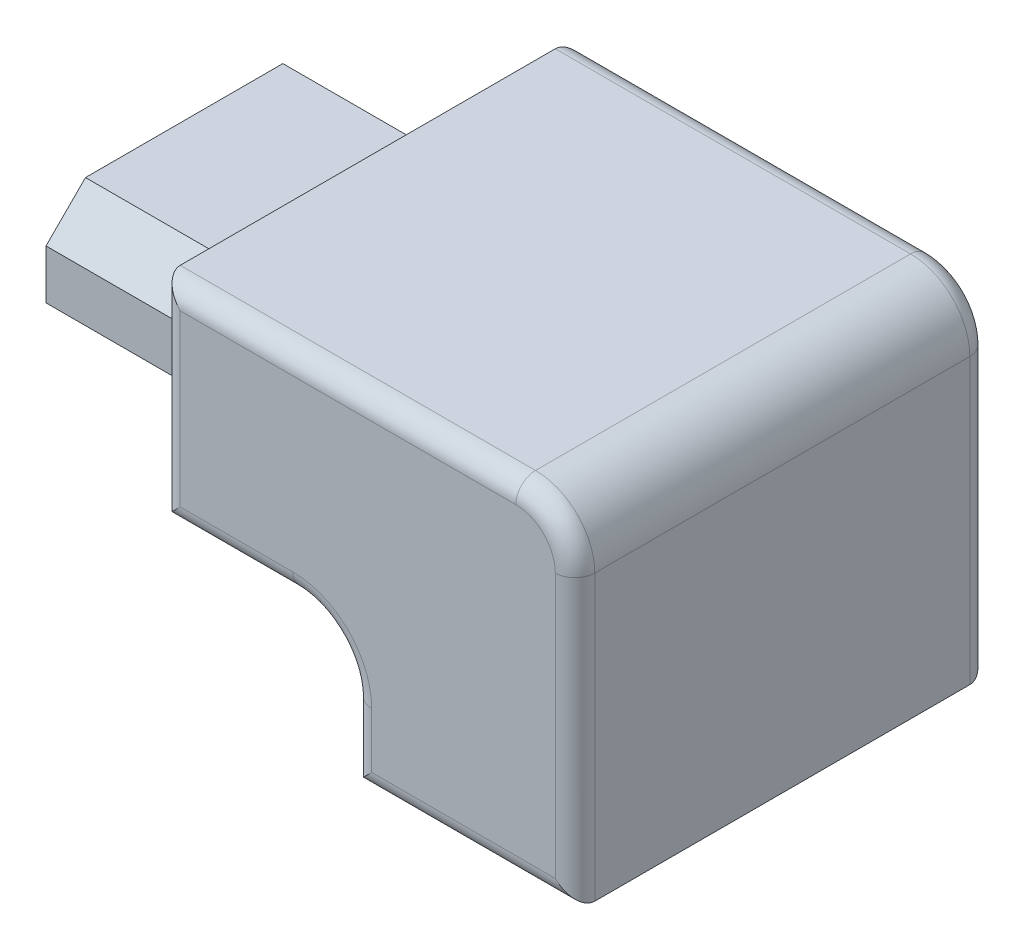
ISO-10303-21;
HEADER;
FILE_DESCRIPTION(('STEP AP214'),'2;1');
FILE_NAME('part.step','',(''),(''),'','','');
FILE_SCHEMA(('AUTOMOTIVE_DESIGN { 1 0 10303 214 1 1 1 1 }'));
ENDSEC;
DATA;
#1=APPLICATION_CONTEXT('core data for automotive mechanical design processes');
#2=APPLICATION_PROTOCOL_DEFINITION('international standard','automotive_design',2000,#1);
#3=PRODUCT_CONTEXT('',#1,'mechanical');
#4=PRODUCT('Part','Part','',(#3));
#5=PRODUCT_RELATED_PRODUCT_CATEGORY('part','',(#4));
#6=PRODUCT_DEFINITION_FORMATION('','',#4);
#7=PRODUCT_DEFINITION_CONTEXT('part definition',#1,'design');
#8=PRODUCT_DEFINITION('design','',#6,#7);
#9=PRODUCT_DEFINITION_SHAPE('','',#8);
#10=(LENGTH_UNIT() NAMED_UNIT(*) SI_UNIT(.MILLI.,.METRE.));
#11=(NAMED_UNIT(*) PLANE_ANGLE_UNIT() SI_UNIT($,.RADIAN.));
#12=(NAMED_UNIT(*) SI_UNIT($,.STERADIAN.) SOLID_ANGLE_UNIT());
#13=UNCERTAINTY_MEASURE_WITH_UNIT(LENGTH_MEASURE(1.E-05),#10,'distance_accuracy_value','');
#14=(GEOMETRIC_REPRESENTATION_CONTEXT(3) GLOBAL_UNCERTAINTY_ASSIGNED_CONTEXT((#13)) GLOBAL_UNIT_ASSIGNED_CONTEXT((#10,
#11,#12)) REPRESENTATION_CONTEXT('',''));
#15=CARTESIAN_POINT('',(0.,0.,0.));
#16=DIRECTION('',(0.,0.,1.));
#17=DIRECTION('',(1.,0.,0.));
#18=AXIS2_PLACEMENT_3D('',#15,#16,#17);
#19=CARTESIAN_POINT('',(-21.,6.8,21.));
#20=DIRECTION('',(1.,0.,0.));
#21=DIRECTION('',(0.,1.,0.));
#22=AXIS2_PLACEMENT_3D('',#19,#20,#21);
#23=PLANE('',#22);
#24=DIRECTION('',(0.,0.,-1.));
#25=VECTOR('',#24,1.);
#26=CARTESIAN_POINT('',(-21.,17.4,21.));
#27=LINE('',#26,#25);
#28=CARTESIAN_POINT('',(-21.,17.4,20.));
#29=VERTEX_POINT('',#28);
#30=CARTESIAN_POINT('',(-21.,17.4,1.00000000000001));
#31=VERTEX_POINT('',#30);
#32=EDGE_CURVE('E332',#29,#31,#27,.T.);
#33=ORIENTED_EDGE('',*,*,#32,.T.);
#34=DIRECTION('',(0.,-1.,0.));
#35=VECTOR('',#34,1.);
#36=CARTESIAN_POINT('',(-21.,6.8,1.));
#37=LINE('',#36,#35);
#38=CARTESIAN_POINT('',(-21.,6.8,1.00000000000001));
#39=VERTEX_POINT('',#38);
#40=EDGE_CURVE('E358',#31,#39,#37,.T.);
#41=ORIENTED_EDGE('',*,*,#40,.T.);
#42=DIRECTION('',(0.,0.,-1.));
#43=VECTOR('',#42,1.);
#44=CARTESIAN_POINT('',(-21.,6.8,21.));
#45=LINE('',#44,#43);
#46=CARTESIAN_POINT('',(-21.,6.8,20.));
#47=VERTEX_POINT('',#46);
#48=EDGE_CURVE('E341',#47,#39,#45,.T.);
#49=ORIENTED_EDGE('',*,*,#48,.F.);
#50=DIRECTION('',(0.,-1.,0.));
#51=VECTOR('',#50,1.);
#52=CARTESIAN_POINT('',(-21.,17.4,20.));
#53=LINE('',#52,#51);
#54=EDGE_CURVE('E356',#47,#29,#53,.F.);
#55=ORIENTED_EDGE('',*,*,#54,.T.);
#56=EDGE_LOOP('',(#33,#41,#49,#55));
#57=FACE_BOUND('',#56,.T.);
#58=DIRECTION('',(0.,1.,0.));
#59=VECTOR('',#58,1.);
#60=CARTESIAN_POINT('',(-21.,9.85,17.5));
#61=LINE('',#60,#59);
#62=CARTESIAN_POINT('',(-21.,9.85,17.5));
#63=VERTEX_POINT('',#62);
#64=CARTESIAN_POINT('',(-21.,12.35,17.5));
#65=VERTEX_POINT('',#64);
#66=EDGE_CURVE('E276',#63,#65,#61,.T.);
#67=ORIENTED_EDGE('',*,*,#66,.F.);
#68=DIRECTION('',(0.,0.,1.));
#69=VECTOR('',#68,1.);
#70=CARTESIAN_POINT('',(-21.,9.85,17.5));
#71=LINE('',#70,#69);
#72=CARTESIAN_POINT('',(-21.,9.85,3.5));
#73=VERTEX_POINT('',#72);
#74=EDGE_CURVE('E288',#73,#63,#71,.T.);
#75=ORIENTED_EDGE('',*,*,#74,.F.);
#76=DIRECTION('',(0.,-1.,0.));
#77=VECTOR('',#76,1.);
#78=CARTESIAN_POINT('',(-21.,9.85,3.5));
#79=LINE('',#78,#77);
#80=CARTESIAN_POINT('',(-21.,12.35,3.5));
#81=VERTEX_POINT('',#80);
#82=EDGE_CURVE('E310',#81,#73,#79,.T.);
#83=ORIENTED_EDGE('',*,*,#82,.F.);
#84=DIRECTION('',(0.,-0.707106781186548,-0.707106781186548));
#85=VECTOR('',#84,1.);
#86=CARTESIAN_POINT('',(-21.,14.35,5.5));
#87=LINE('',#86,#85);
#88=CARTESIAN_POINT('',(-21.,14.35,5.5));
#89=VERTEX_POINT('',#88);
#90=EDGE_CURVE('E307',#89,#81,#87,.T.);
#91=ORIENTED_EDGE('',*,*,#90,.F.);
#92=DIRECTION('',(0.,0.,-1.));
#93=VECTOR('',#92,1.);
#94=CARTESIAN_POINT('',(-21.,14.35,15.5));
#95=LINE('',#94,#93);
#96=CARTESIAN_POINT('',(-21.,14.35,15.5));
#97=VERTEX_POINT('',#96);
#98=EDGE_CURVE('E304',#97,#89,#95,.T.);
#99=ORIENTED_EDGE('',*,*,#98,.F.);
#100=DIRECTION('',(0.,0.707106781186548,-0.707106781186548));
#101=VECTOR('',#100,1.);
#102=CARTESIAN_POINT('',(-21.,12.35,17.5));
#103=LINE('',#102,#101);
#104=EDGE_CURVE('E301',#65,#97,#103,.T.);
#105=ORIENTED_EDGE('',*,*,#104,.F.);
#106=EDGE_LOOP('',(#67,#75,#83,#91,#99,#105));
#107=FACE_BOUND('',#106,.T.);
#108=ADVANCED_FACE('F39',(#57,#107),#23,.F.);
#109=CARTESIAN_POINT('',(-11.3,6.8,21.));
#110=DIRECTION('',(0.,1.,0.));
#111=DIRECTION('',(-1.,0.,0.));
#112=AXIS2_PLACEMENT_3D('',#109,#110,#111);
#113=PLANE('',#112);
#114=ORIENTED_EDGE('',*,*,#48,.T.);
#115=DIRECTION('',(1.,0.,0.));
#116=VECTOR('',#115,1.);
#117=CARTESIAN_POINT('',(-11.3,6.8,1.));
#118=LINE('',#117,#116);
#119=CARTESIAN_POINT('',(-14.3,6.8,1.));
#120=VERTEX_POINT('',#119);
#121=EDGE_CURVE('E380',#39,#120,#118,.T.);
#122=ORIENTED_EDGE('',*,*,#121,.T.);
#123=DIRECTION('',(0.,0.,-1.));
#124=VECTOR('',#123,1.);
#125=CARTESIAN_POINT('',(-14.3,6.8,21.));
#126=LINE('',#125,#124);
#127=CARTESIAN_POINT('',(-14.3,6.8,20.));
#128=VERTEX_POINT('',#127);
#129=EDGE_CURVE('E347',#120,#128,#126,.F.);
#130=ORIENTED_EDGE('',*,*,#129,.T.);
#131=DIRECTION('',(1.,0.,0.));
#132=VECTOR('',#131,1.);
#133=CARTESIAN_POINT('',(-21.,6.8,20.));
#134=LINE('',#133,#132);
#135=EDGE_CURVE('E378',#128,#47,#134,.F.);
#136=ORIENTED_EDGE('',*,*,#135,.T.);
#137=EDGE_LOOP('',(#114,#122,#130,#136));
#138=FACE_BOUND('',#137,.T.);
#139=ADVANCED_FACE('F491',(#138),#113,.F.);
#140=CARTESIAN_POINT('',(-11.3,6.8,21.));
#141=DIRECTION('',(1.,0.,0.));
#142=DIRECTION('',(0.,0.,-1.));
#143=AXIS2_PLACEMENT_3D('',#140,#141,#142);
#144=PLANE('',#143);
#145=DIRECTION('',(0.,0.,-1.));
#146=VECTOR('',#145,1.);
#147=CARTESIAN_POINT('',(-11.3,3.8,0.));
#148=LINE('',#147,#146);
#149=CARTESIAN_POINT('',(-11.3,3.8,20.));
#150=VERTEX_POINT('',#149);
#151=CARTESIAN_POINT('',(-11.3,3.8,1.));
#152=VERTEX_POINT('',#151);
#153=EDGE_CURVE('E344',#150,#152,#148,.T.);
#154=ORIENTED_EDGE('',*,*,#153,.T.);
#155=DIRECTION('',(0.,-1.,0.));
#156=VECTOR('',#155,1.);
#157=CARTESIAN_POINT('',(-11.3,6.8,1.));
#158=LINE('',#157,#156);
#159=CARTESIAN_POINT('',(-11.3,0.,1.00000000000001));
#160=VERTEX_POINT('',#159);
#161=EDGE_CURVE('E388',#152,#160,#158,.T.);
#162=ORIENTED_EDGE('',*,*,#161,.T.);
#163=DIRECTION('',(0.,0.,-1.));
#164=VECTOR('',#163,1.);
#165=CARTESIAN_POINT('',(-11.3,0.,21.));
#166=LINE('',#165,#164);
#167=CARTESIAN_POINT('',(-11.3,0.,20.));
#168=VERTEX_POINT('',#167);
#169=EDGE_CURVE('E338',#168,#160,#166,.T.);
#170=ORIENTED_EDGE('',*,*,#169,.F.);
#171=DIRECTION('',(0.,-1.,0.));
#172=VECTOR('',#171,1.);
#173=CARTESIAN_POINT('',(-11.3,3.8,20.));
#174=LINE('',#173,#172);
#175=EDGE_CURVE('E386',#168,#150,#174,.F.);
#176=ORIENTED_EDGE('',*,*,#175,.T.);
#177=EDGE_LOOP('',(#154,#162,#170,#176));
#178=FACE_BOUND('',#177,.T.);
#179=ADVANCED_FACE('F516',(#178),#144,.F.);
#180=CARTESIAN_POINT('',(0.,0.,21.));
#181=DIRECTION('',(0.,1.,0.));
#182=DIRECTION('',(-1.,0.,0.));
#183=AXIS2_PLACEMENT_3D('',#180,#181,#182);
#184=PLANE('',#183);
#185=DIRECTION('',(1.,0.,0.));
#186=VECTOR('',#185,1.);
#187=CARTESIAN_POINT('',(-7.9,0.,3.5));
#188=LINE('',#187,#186);
#189=CARTESIAN_POINT('',(-7.9,0.,3.5));
#190=VERTEX_POINT('',#189);
#191=CARTESIAN_POINT('',(-5.4,0.,3.5));
#192=VERTEX_POINT('',#191);
#193=EDGE_CURVE('E263',#190,#192,#188,.T.);
#194=ORIENTED_EDGE('',*,*,#193,.F.);
#195=DIRECTION('',(0.,0.,-1.));
#196=VECTOR('',#195,1.);
#197=CARTESIAN_POINT('',(-7.9,0.,3.5));
#198=LINE('',#197,#196);
#199=CARTESIAN_POINT('',(-7.9,0.,17.5));
#200=VERTEX_POINT('',#199);
#201=EDGE_CURVE('E231',#200,#190,#198,.T.);
#202=ORIENTED_EDGE('',*,*,#201,.F.);
#203=DIRECTION('',(-1.,0.,0.));
#204=VECTOR('',#203,1.);
#205=CARTESIAN_POINT('',(-7.9,0.,17.5));
#206=LINE('',#205,#204);
#207=CARTESIAN_POINT('',(-5.4,0.,17.5));
#208=VERTEX_POINT('',#207);
#209=EDGE_CURVE('E249',#208,#200,#206,.T.);
#210=ORIENTED_EDGE('',*,*,#209,.F.);
#211=DIRECTION('',(-0.707106781186548,0.,0.707106781186548));
#212=VECTOR('',#211,1.);
#213=CARTESIAN_POINT('',(-5.4,0.,17.5));
#214=LINE('',#213,#212);
#215=CARTESIAN_POINT('',(-3.4,0.,15.5));
#216=VERTEX_POINT('',#215);
#217=EDGE_CURVE('E252',#216,#208,#214,.T.);
#218=ORIENTED_EDGE('',*,*,#217,.F.);
#219=DIRECTION('',(0.,0.,1.));
#220=VECTOR('',#219,1.);
#221=CARTESIAN_POINT('',(-3.4,0.,5.5));
#222=LINE('',#221,#220);
#223=CARTESIAN_POINT('',(-3.4,0.,5.5));
#224=VERTEX_POINT('',#223);
#225=EDGE_CURVE('E269',#224,#216,#222,.T.);
#226=ORIENTED_EDGE('',*,*,#225,.F.);
#227=DIRECTION('',(0.707106781186548,0.,0.707106781186548));
#228=VECTOR('',#227,1.);
#229=CARTESIAN_POINT('',(-5.4,0.,3.5));
#230=LINE('',#229,#228);
#231=EDGE_CURVE('E266',#192,#224,#230,.T.);
#232=ORIENTED_EDGE('',*,*,#231,.F.);
#233=EDGE_LOOP('',(#194,#202,#210,#218,#226,#232));
#234=FACE_BOUND('',#233,.T.);
#235=ORIENTED_EDGE('',*,*,#169,.T.);
#236=DIRECTION('',(1.,0.,0.));
#237=VECTOR('',#236,1.);
#238=CARTESIAN_POINT('',(0.,0.,1.));
#239=LINE('',#238,#237);
#240=CARTESIAN_POINT('',(0.,0.,1.00000000000001));
#241=VERTEX_POINT('',#240);
#242=EDGE_CURVE('E393',#160,#241,#239,.T.);
#243=ORIENTED_EDGE('',*,*,#242,.T.);
#244=DIRECTION('',(0.,0.,-1.));
#245=VECTOR('',#244,1.);
#246=CARTESIAN_POINT('',(0.,0.,21.));
#247=LINE('',#246,#245);
#248=CARTESIAN_POINT('',(0.,0.,20.));
#249=VERTEX_POINT('',#248);
#250=EDGE_CURVE('E335',#249,#241,#247,.T.);
#251=ORIENTED_EDGE('',*,*,#250,.F.);
#252=DIRECTION('',(1.,0.,0.));
#253=VECTOR('',#252,1.);
#254=CARTESIAN_POINT('',(-11.3,0.,20.));
#255=LINE('',#254,#253);
#256=EDGE_CURVE('E390',#249,#168,#255,.F.);
#257=ORIENTED_EDGE('',*,*,#256,.T.);
#258=EDGE_LOOP('',(#235,#243,#251,#257));
#259=FACE_BOUND('',#258,.T.);
#260=ADVANCED_FACE('F519',(#234,#259),#184,.F.);
#261=CARTESIAN_POINT('',(0.,17.4,21.));
#262=DIRECTION('',(-1.,0.,0.));
#263=DIRECTION('',(0.,-1.,0.));
#264=AXIS2_PLACEMENT_3D('',#261,#262,#263);
#265=PLANE('',#264);
#266=ORIENTED_EDGE('',*,*,#250,.T.);
#267=DIRECTION('',(0.,1.,0.));
#268=VECTOR('',#267,1.);
#269=CARTESIAN_POINT('',(0.,17.4,1.));
#270=LINE('',#269,#268);
#271=CARTESIAN_POINT('',(0.,14.4,1.));
#272=VERTEX_POINT('',#271);
#273=EDGE_CURVE('E397',#241,#272,#270,.T.);
#274=ORIENTED_EDGE('',*,*,#273,.T.);
#275=DIRECTION('',(0.,0.,-1.));
#276=VECTOR('',#275,1.);
#277=CARTESIAN_POINT('',(0.,14.4,21.));
#278=LINE('',#277,#276);
#279=CARTESIAN_POINT('',(0.,14.4,20.));
#280=VERTEX_POINT('',#279);
#281=EDGE_CURVE('E353',#272,#280,#278,.F.);
#282=ORIENTED_EDGE('',*,*,#281,.T.);
#283=DIRECTION('',(0.,1.,0.));
#284=VECTOR('',#283,1.);
#285=CARTESIAN_POINT('',(0.,0.,20.));
#286=LINE('',#285,#284);
#287=EDGE_CURVE('E395',#280,#249,#286,.F.);
#288=ORIENTED_EDGE('',*,*,#287,.T.);
#289=EDGE_LOOP('',(#266,#274,#282,#288));
#290=FACE_BOUND('',#289,.T.);
#291=ADVANCED_FACE('F533',(#290),#265,.F.);
#292=CARTESIAN_POINT('',(0.,17.4,21.));
#293=DIRECTION('',(0.,-1.,0.));
#294=DIRECTION('',(0.,0.,-1.));
#295=AXIS2_PLACEMENT_3D('',#292,#293,#294);
#296=PLANE('',#295);
#297=DIRECTION('',(0.,0.,-1.));
#298=VECTOR('',#297,1.);
#299=CARTESIAN_POINT('',(-3.,17.4,21.));
#300=LINE('',#299,#298);
#301=CARTESIAN_POINT('',(-3.,17.4,20.));
#302=VERTEX_POINT('',#301);
#303=CARTESIAN_POINT('',(-3.,17.4,1.));
#304=VERTEX_POINT('',#303);
#305=EDGE_CURVE('E350',#302,#304,#300,.T.);
#306=ORIENTED_EDGE('',*,*,#305,.T.);
#307=DIRECTION('',(-1.,0.,0.));
#308=VECTOR('',#307,1.);
#309=CARTESIAN_POINT('',(0.,17.4,1.));
#310=LINE('',#309,#308);
#311=EDGE_CURVE('E405',#304,#31,#310,.T.);
#312=ORIENTED_EDGE('',*,*,#311,.T.);
#313=ORIENTED_EDGE('',*,*,#32,.F.);
#314=DIRECTION('',(-1.,0.,0.));
#315=VECTOR('',#314,1.);
#316=CARTESIAN_POINT('',(-3.,17.4,20.));
#317=LINE('',#316,#315);
#318=EDGE_CURVE('E403',#29,#302,#317,.F.);
#319=ORIENTED_EDGE('',*,*,#318,.T.);
#320=EDGE_LOOP('',(#306,#312,#313,#319));
#321=FACE_BOUND('',#320,.T.);
#322=ADVANCED_FACE('F477',(#321),#296,.F.);
#323=CARTESIAN_POINT('',(0.,0.,21.));
#324=DIRECTION('',(0.,0.,1.));
#325=DIRECTION('',(1.,0.,0.));
#326=AXIS2_PLACEMENT_3D('',#323,#324,#325);
#327=PLANE('',#326);
#328=DIRECTION('',(0.,-1.,0.));
#329=VECTOR('',#328,1.);
#330=CARTESIAN_POINT('',(-10.3,0.,21.));
#331=LINE('',#330,#329);
#332=CARTESIAN_POINT('',(-10.3,3.8,21.));
#333=VERTEX_POINT('',#332);
#334=CARTESIAN_POINT('',(-10.3,0.999999999999999,21.));
#335=VERTEX_POINT('',#334);
#336=EDGE_CURVE('E48',#333,#335,#331,.T.);
#337=ORIENTED_EDGE('',*,*,#336,.T.);
#338=DIRECTION('',(1.,0.,0.));
#339=VECTOR('',#338,1.);
#340=CARTESIAN_POINT('',(0.,1.,21.));
#341=LINE('',#340,#339);
#342=CARTESIAN_POINT('',(-1.,1.,21.));
#343=VERTEX_POINT('',#342);
#344=EDGE_CURVE('E11',#335,#343,#341,.T.);
#345=ORIENTED_EDGE('',*,*,#344,.T.);
#346=DIRECTION('',(0.,1.,0.));
#347=VECTOR('',#346,1.);
#348=CARTESIAN_POINT('',(-1.,14.4,21.));
#349=LINE('',#348,#347);
#350=CARTESIAN_POINT('',(-1.,14.4,21.));
#351=VERTEX_POINT('',#350);
#352=EDGE_CURVE('E407',#343,#351,#349,.T.);
#353=ORIENTED_EDGE('',*,*,#352,.T.);
#354=CARTESIAN_POINT('',(-3.,14.4,21.));
#355=DIRECTION('',(0.,0.,1.));
#356=DIRECTION('',(1.,0.,0.));
#357=AXIS2_PLACEMENT_3D('',#354,#355,#356);
#358=CIRCLE('',#357,2.);
#359=CARTESIAN_POINT('',(-3.,16.4,21.));
#360=VERTEX_POINT('',#359);
#361=EDGE_CURVE('E409',#351,#360,#358,.T.);
#362=ORIENTED_EDGE('',*,*,#361,.T.);
#363=DIRECTION('',(-1.,0.,0.));
#364=VECTOR('',#363,1.);
#365=CARTESIAN_POINT('',(-21.,16.4,21.));
#366=LINE('',#365,#364);
#367=CARTESIAN_POINT('',(-20.,16.4,21.));
#368=VERTEX_POINT('',#367);
#369=EDGE_CURVE('E411',#360,#368,#366,.T.);
#370=ORIENTED_EDGE('',*,*,#369,.T.);
#371=DIRECTION('',(0.,-1.,0.));
#372=VECTOR('',#371,1.);
#373=CARTESIAN_POINT('',(-20.,6.8,21.));
#374=LINE('',#373,#372);
#375=CARTESIAN_POINT('',(-20.,7.8,21.));
#376=VERTEX_POINT('',#375);
#377=EDGE_CURVE('E413',#368,#376,#374,.T.);
#378=ORIENTED_EDGE('',*,*,#377,.T.);
#379=DIRECTION('',(1.,0.,0.));
#380=VECTOR('',#379,1.);
#381=CARTESIAN_POINT('',(-14.3,7.8,21.));
#382=LINE('',#381,#380);
#383=CARTESIAN_POINT('',(-14.3,7.8,21.));
#384=VERTEX_POINT('',#383);
#385=EDGE_CURVE('E415',#376,#384,#382,.T.);
#386=ORIENTED_EDGE('',*,*,#385,.T.);
#387=CARTESIAN_POINT('',(-14.3,3.8,21.));
#388=DIRECTION('',(0.,0.,1.));
#389=DIRECTION('',(1.,0.,0.));
#390=AXIS2_PLACEMENT_3D('',#387,#388,#389);
#391=CIRCLE('',#390,4.);
#392=EDGE_CURVE('E59',#384,#333,#391,.F.);
#393=ORIENTED_EDGE('',*,*,#392,.T.);
#394=EDGE_LOOP('',(#337,#345,#353,#362,#370,#378,#386,#393));
#395=FACE_BOUND('',#394,.T.);
#396=ADVANCED_FACE('F912',(#395),#327,.T.);
#397=CARTESIAN_POINT('',(0.,0.,0.));
#398=DIRECTION('',(0.,0.,1.));
#399=DIRECTION('',(1.,0.,0.));
#400=AXIS2_PLACEMENT_3D('',#397,#398,#399);
#401=PLANE('',#400);
#402=DIRECTION('',(1.,0.,0.));
#403=VECTOR('',#402,1.);
#404=CARTESIAN_POINT('',(0.,7.8,0.));
#405=LINE('',#404,#403);
#406=CARTESIAN_POINT('',(-14.3,7.8,0.));
#407=VERTEX_POINT('',#406);
#408=CARTESIAN_POINT('',(-20.,7.8,0.));
#409=VERTEX_POINT('',#408);
#410=EDGE_CURVE('E373',#407,#409,#405,.F.);
#411=ORIENTED_EDGE('',*,*,#410,.T.);
#412=DIRECTION('',(0.,-1.,0.));
#413=VECTOR('',#412,1.);
#414=CARTESIAN_POINT('',(-20.,0.,0.));
#415=LINE('',#414,#413);
#416=CARTESIAN_POINT('',(-20.,16.4,0.));
#417=VERTEX_POINT('',#416);
#418=EDGE_CURVE('E375',#409,#417,#415,.F.);
#419=ORIENTED_EDGE('',*,*,#418,.T.);
#420=DIRECTION('',(-1.,0.,0.));
#421=VECTOR('',#420,1.);
#422=CARTESIAN_POINT('',(0.,16.4,0.));
#423=LINE('',#422,#421);
#424=CARTESIAN_POINT('',(-3.,16.4,0.));
#425=VERTEX_POINT('',#424);
#426=EDGE_CURVE('E361',#417,#425,#423,.F.);
#427=ORIENTED_EDGE('',*,*,#426,.T.);
#428=CARTESIAN_POINT('',(-3.,14.4,0.));
#429=DIRECTION('',(0.,0.,1.));
#430=DIRECTION('',(1.,0.,0.));
#431=AXIS2_PLACEMENT_3D('',#428,#429,#430);
#432=CIRCLE('',#431,2.);
#433=CARTESIAN_POINT('',(-1.,14.4,0.));
#434=VERTEX_POINT('',#433);
#435=EDGE_CURVE('E363',#425,#434,#432,.F.);
#436=ORIENTED_EDGE('',*,*,#435,.T.);
#437=DIRECTION('',(0.,1.,0.));
#438=VECTOR('',#437,1.);
#439=CARTESIAN_POINT('',(-1.,0.,0.));
#440=LINE('',#439,#438);
#441=CARTESIAN_POINT('',(-1.,1.,0.));
#442=VERTEX_POINT('',#441);
#443=EDGE_CURVE('E365',#434,#442,#440,.F.);
#444=ORIENTED_EDGE('',*,*,#443,.T.);
#445=DIRECTION('',(1.,0.,0.));
#446=VECTOR('',#445,1.);
#447=CARTESIAN_POINT('',(0.,1.,0.));
#448=LINE('',#447,#446);
#449=CARTESIAN_POINT('',(-10.3,0.999999999999999,0.));
#450=VERTEX_POINT('',#449);
#451=EDGE_CURVE('E367',#442,#450,#448,.F.);
#452=ORIENTED_EDGE('',*,*,#451,.T.);
#453=DIRECTION('',(0.,-1.,0.));
#454=VECTOR('',#453,1.);
#455=CARTESIAN_POINT('',(-10.3,0.,0.));
#456=LINE('',#455,#454);
#457=CARTESIAN_POINT('',(-10.3,3.8,0.));
#458=VERTEX_POINT('',#457);
#459=EDGE_CURVE('E369',#450,#458,#456,.F.);
#460=ORIENTED_EDGE('',*,*,#459,.T.);
#461=CARTESIAN_POINT('',(-14.3,3.8,0.));
#462=DIRECTION('',(0.,0.,1.));
#463=DIRECTION('',(1.,0.,0.));
#464=AXIS2_PLACEMENT_3D('',#461,#462,#463);
#465=CIRCLE('',#464,4.);
#466=EDGE_CURVE('E371',#458,#407,#465,.T.);
#467=ORIENTED_EDGE('',*,*,#466,.T.);
#468=EDGE_LOOP('',(#411,#419,#427,#436,#444,#452,#460,#467));
#469=FACE_BOUND('',#468,.T.);
#470=ADVANCED_FACE('F507',(#469),#401,.F.);
#471=CARTESIAN_POINT('',(-30.3,9.85000000000001,17.5));
#472=DIRECTION('',(0.,0.,-1.));
#473=DIRECTION('',(0.,1.,0.));
#474=AXIS2_PLACEMENT_3D('',#471,#472,#473);
#475=PLANE('',#474);
#476=ORIENTED_EDGE('',*,*,#66,.T.);
#477=DIRECTION('',(1.,0.,0.));
#478=VECTOR('',#477,1.);
#479=CARTESIAN_POINT('',(-30.3,12.35,17.5));
#480=LINE('',#479,#478);
#481=CARTESIAN_POINT('',(-30.3,12.35,17.5));
#482=VERTEX_POINT('',#481);
#483=EDGE_CURVE('E329',#482,#65,#480,.T.);
#484=ORIENTED_EDGE('',*,*,#483,.F.);
#485=DIRECTION('',(0.,1.,0.));
#486=VECTOR('',#485,1.);
#487=CARTESIAN_POINT('',(-30.3,9.85000000000001,17.5));
#488=LINE('',#487,#486);
#489=CARTESIAN_POINT('',(-30.3,9.85000000000001,17.5));
#490=VERTEX_POINT('',#489);
#491=EDGE_CURVE('E284',#490,#482,#488,.T.);
#492=ORIENTED_EDGE('',*,*,#491,.F.);
#493=DIRECTION('',(1.,0.,0.));
#494=VECTOR('',#493,1.);
#495=CARTESIAN_POINT('',(-30.3,9.85000000000001,17.5));
#496=LINE('',#495,#494);
#497=EDGE_CURVE('E298',#490,#63,#496,.T.);
#498=ORIENTED_EDGE('',*,*,#497,.T.);
#499=EDGE_LOOP('',(#476,#484,#492,#498));
#500=FACE_BOUND('',#499,.T.);
#501=ADVANCED_FACE('F623',(#500),#475,.F.);
#502=CARTESIAN_POINT('',(-30.3,12.35,17.5));
#503=DIRECTION('',(0.,-0.707106781186548,-0.707106781186548));
#504=DIRECTION('',(0.,0.707106781186548,-0.707106781186548));
#505=AXIS2_PLACEMENT_3D('',#502,#503,#504);
#506=PLANE('',#505);
#507=ORIENTED_EDGE('',*,*,#104,.T.);
#508=DIRECTION('',(1.,0.,0.));
#509=VECTOR('',#508,1.);
#510=CARTESIAN_POINT('',(-30.3,14.35,15.5));
#511=LINE('',#510,#509);
#512=CARTESIAN_POINT('',(-30.3,14.35,15.5));
#513=VERTEX_POINT('',#512);
#514=EDGE_CURVE('E326',#513,#97,#511,.T.);
#515=ORIENTED_EDGE('',*,*,#514,.F.);
#516=DIRECTION('',(0.,0.707106781186548,-0.707106781186548));
#517=VECTOR('',#516,1.);
#518=CARTESIAN_POINT('',(-30.3,12.35,17.5));
#519=LINE('',#518,#517);
#520=EDGE_CURVE('E287',#482,#513,#519,.T.);
#521=ORIENTED_EDGE('',*,*,#520,.F.);
#522=ORIENTED_EDGE('',*,*,#483,.T.);
#523=EDGE_LOOP('',(#507,#515,#521,#522));
#524=FACE_BOUND('',#523,.T.);
#525=ADVANCED_FACE('F617',(#524),#506,.F.);
#526=CARTESIAN_POINT('',(-30.3,14.35,15.5));
#527=DIRECTION('',(0.,-1.,0.));
#528=DIRECTION('',(0.,0.,-1.));
#529=AXIS2_PLACEMENT_3D('',#526,#527,#528);
#530=PLANE('',#529);
#531=ORIENTED_EDGE('',*,*,#98,.T.);
#532=DIRECTION('',(1.,0.,0.));
#533=VECTOR('',#532,1.);
#534=CARTESIAN_POINT('',(-30.3,14.35,5.5));
#535=LINE('',#534,#533);
#536=CARTESIAN_POINT('',(-30.3,14.35,5.5));
#537=VERTEX_POINT('',#536);
#538=EDGE_CURVE('E323',#537,#89,#535,.T.);
#539=ORIENTED_EDGE('',*,*,#538,.F.);
#540=DIRECTION('',(0.,0.,-1.));
#541=VECTOR('',#540,1.);
#542=CARTESIAN_POINT('',(-30.3,14.35,15.5));
#543=LINE('',#542,#541);
#544=EDGE_CURVE('E290',#513,#537,#543,.T.);
#545=ORIENTED_EDGE('',*,*,#544,.F.);
#546=ORIENTED_EDGE('',*,*,#514,.T.);
#547=EDGE_LOOP('',(#531,#539,#545,#546));
#548=FACE_BOUND('',#547,.T.);
#549=ADVANCED_FACE('F622',(#548),#530,.F.);
#550=CARTESIAN_POINT('',(-30.3,14.35,5.5));
#551=DIRECTION('',(0.,-0.707106781186548,0.707106781186548));
#552=DIRECTION('',(0.,-0.707106781186548,-0.707106781186548));
#553=AXIS2_PLACEMENT_3D('',#550,#551,#552);
#554=PLANE('',#553);
#555=ORIENTED_EDGE('',*,*,#90,.T.);
#556=DIRECTION('',(1.,0.,0.));
#557=VECTOR('',#556,1.);
#558=CARTESIAN_POINT('',(-30.3,12.35,3.5));
#559=LINE('',#558,#557);
#560=CARTESIAN_POINT('',(-30.3,12.35,3.5));
#561=VERTEX_POINT('',#560);
#562=EDGE_CURVE('E320',#561,#81,#559,.T.);
#563=ORIENTED_EDGE('',*,*,#562,.F.);
#564=DIRECTION('',(0.,-0.707106781186548,-0.707106781186548));
#565=VECTOR('',#564,1.);
#566=CARTESIAN_POINT('',(-30.3,14.35,5.5));
#567=LINE('',#566,#565);
#568=EDGE_CURVE('E292',#537,#561,#567,.T.);
#569=ORIENTED_EDGE('',*,*,#568,.F.);
#570=ORIENTED_EDGE('',*,*,#538,.T.);
#571=EDGE_LOOP('',(#555,#563,#569,#570));
#572=FACE_BOUND('',#571,.T.);
#573=ADVANCED_FACE('F635',(#572),#554,.F.);
#574=CARTESIAN_POINT('',(-30.3,9.85,3.5));
#575=DIRECTION('',(0.,0.,1.));
#576=DIRECTION('',(1.,0.,0.));
#577=AXIS2_PLACEMENT_3D('',#574,#575,#576);
#578=PLANE('',#577);
#579=ORIENTED_EDGE('',*,*,#82,.T.);
#580=DIRECTION('',(1.,0.,0.));
#581=VECTOR('',#580,1.);
#582=CARTESIAN_POINT('',(-30.3,9.85,3.5));
#583=LINE('',#582,#581);
#584=CARTESIAN_POINT('',(-30.3,9.85,3.5));
#585=VERTEX_POINT('',#584);
#586=EDGE_CURVE('E317',#585,#73,#583,.T.);
#587=ORIENTED_EDGE('',*,*,#586,.F.);
#588=DIRECTION('',(0.,-1.,0.));
#589=VECTOR('',#588,1.);
#590=CARTESIAN_POINT('',(-30.3,9.85,3.5));
#591=LINE('',#590,#589);
#592=EDGE_CURVE('E294',#561,#585,#591,.T.);
#593=ORIENTED_EDGE('',*,*,#592,.F.);
#594=ORIENTED_EDGE('',*,*,#562,.T.);
#595=EDGE_LOOP('',(#579,#587,#593,#594));
#596=FACE_BOUND('',#595,.T.);
#597=ADVANCED_FACE('F668',(#596),#578,.F.);
#598=CARTESIAN_POINT('',(-30.3,9.85000000000001,17.5));
#599=DIRECTION('',(0.,1.,0.));
#600=DIRECTION('',(-1.,0.,0.));
#601=AXIS2_PLACEMENT_3D('',#598,#599,#600);
#602=PLANE('',#601);
#603=ORIENTED_EDGE('',*,*,#74,.T.);
#604=ORIENTED_EDGE('',*,*,#497,.F.);
#605=DIRECTION('',(0.,0.,1.));
#606=VECTOR('',#605,1.);
#607=CARTESIAN_POINT('',(-30.3,9.85000000000001,17.5));
#608=LINE('',#607,#606);
#609=EDGE_CURVE('E296',#585,#490,#608,.T.);
#610=ORIENTED_EDGE('',*,*,#609,.F.);
#611=ORIENTED_EDGE('',*,*,#586,.T.);
#612=EDGE_LOOP('',(#603,#604,#610,#611));
#613=FACE_BOUND('',#612,.T.);
#614=ADVANCED_FACE('F656',(#613),#602,.F.);
#615=CARTESIAN_POINT('',(-30.3,0.,0.));
#616=DIRECTION('',(-1.,0.,0.));
#617=DIRECTION('',(0.,0.,1.));
#618=AXIS2_PLACEMENT_3D('',#615,#616,#617);
#619=PLANE('',#618);
#620=ORIENTED_EDGE('',*,*,#491,.T.);
#621=ORIENTED_EDGE('',*,*,#520,.T.);
#622=ORIENTED_EDGE('',*,*,#544,.T.);
#623=ORIENTED_EDGE('',*,*,#568,.T.);
#624=ORIENTED_EDGE('',*,*,#592,.T.);
#625=ORIENTED_EDGE('',*,*,#609,.T.);
#626=EDGE_LOOP('',(#620,#621,#622,#623,#624,#625));
#627=FACE_BOUND('',#626,.T.);
#628=ADVANCED_FACE('F651',(#627),#619,.T.);
#629=CARTESIAN_POINT('',(-7.9,0.0999999999999991,3.5));
#630=DIRECTION('',(-1.,0.,0.));
#631=DIRECTION('',(0.,-1.,0.));
#632=AXIS2_PLACEMENT_3D('',#629,#630,#631);
#633=PLANE('',#632);
#634=ORIENTED_EDGE('',*,*,#201,.T.);
#635=DIRECTION('',(0.,-1.,0.));
#636=VECTOR('',#635,1.);
#637=CARTESIAN_POINT('',(-7.9,0.0999999999999991,3.5));
#638=LINE('',#637,#636);
#639=CARTESIAN_POINT('',(-7.9,0.0999999999999991,3.5));
#640=VERTEX_POINT('',#639);
#641=EDGE_CURVE('E224',#640,#190,#638,.T.);
#642=ORIENTED_EDGE('',*,*,#641,.F.);
#643=DIRECTION('',(0.,0.,-1.));
#644=VECTOR('',#643,1.);
#645=CARTESIAN_POINT('',(-7.9,0.0999999999999991,3.5));
#646=LINE('',#645,#644);
#647=CARTESIAN_POINT('',(-7.9,0.0999999999999991,17.5));
#648=VERTEX_POINT('',#647);
#649=EDGE_CURVE('E228',#648,#640,#646,.T.);
#650=ORIENTED_EDGE('',*,*,#649,.F.);
#651=DIRECTION('',(0.,-1.,0.));
#652=VECTOR('',#651,1.);
#653=CARTESIAN_POINT('',(-7.9,0.0999999999999991,17.5));
#654=LINE('',#653,#652);
#655=EDGE_CURVE('E274',#648,#200,#654,.T.);
#656=ORIENTED_EDGE('',*,*,#655,.T.);
#657=EDGE_LOOP('',(#634,#642,#650,#656));
#658=FACE_BOUND('',#657,.T.);
#659=ADVANCED_FACE('F226',(#658),#633,.F.);
#660=CARTESIAN_POINT('',(-7.9,0.0999999999999991,17.5));
#661=DIRECTION('',(0.,0.,1.));
#662=DIRECTION('',(1.,0.,0.));
#663=AXIS2_PLACEMENT_3D('',#660,#661,#662);
#664=PLANE('',#663);
#665=ORIENTED_EDGE('',*,*,#209,.T.);
#666=ORIENTED_EDGE('',*,*,#655,.F.);
#667=DIRECTION('',(-1.,0.,0.));
#668=VECTOR('',#667,1.);
#669=CARTESIAN_POINT('',(-7.9,0.0999999999999991,17.5));
#670=LINE('',#669,#668);
#671=CARTESIAN_POINT('',(-5.4,0.0999999999999994,17.5));
#672=VERTEX_POINT('',#671);
#673=EDGE_CURVE('E236',#672,#648,#670,.T.);
#674=ORIENTED_EDGE('',*,*,#673,.F.);
#675=DIRECTION('',(0.,-1.,0.));
#676=VECTOR('',#675,1.);
#677=CARTESIAN_POINT('',(-5.4,0.0999999999999994,17.5));
#678=LINE('',#677,#676);
#679=EDGE_CURVE('E277',#672,#208,#678,.T.);
#680=ORIENTED_EDGE('',*,*,#679,.T.);
#681=EDGE_LOOP('',(#665,#666,#674,#680));
#682=FACE_BOUND('',#681,.T.);
#683=ADVANCED_FACE('F873',(#682),#664,.F.);
#684=CARTESIAN_POINT('',(-5.4,0.0999999999999994,17.5));
#685=DIRECTION('',(0.707106781186548,0.,0.707106781186548));
#686=DIRECTION('',(0.707106781186548,0.,-0.707106781186548));
#687=AXIS2_PLACEMENT_3D('',#684,#685,#686);
#688=PLANE('',#687);
#689=ORIENTED_EDGE('',*,*,#217,.T.);
#690=ORIENTED_EDGE('',*,*,#679,.F.);
#691=DIRECTION('',(-0.707106781186548,0.,0.707106781186548));
#692=VECTOR('',#691,1.);
#693=CARTESIAN_POINT('',(-5.4,0.0999999999999994,17.5));
#694=LINE('',#693,#692);
#695=CARTESIAN_POINT('',(-3.4,0.0999999999999996,15.5));
#696=VERTEX_POINT('',#695);
#697=EDGE_CURVE('E259',#696,#672,#694,.T.);
#698=ORIENTED_EDGE('',*,*,#697,.F.);
#699=DIRECTION('',(0.,-1.,0.));
#700=VECTOR('',#699,1.);
#701=CARTESIAN_POINT('',(-3.4,0.0999999999999996,15.5));
#702=LINE('',#701,#700);
#703=EDGE_CURVE('E279',#696,#216,#702,.T.);
#704=ORIENTED_EDGE('',*,*,#703,.T.);
#705=EDGE_LOOP('',(#689,#690,#698,#704));
#706=FACE_BOUND('',#705,.T.);
#707=ADVANCED_FACE('F864',(#706),#688,.F.);
#708=CARTESIAN_POINT('',(-3.4,0.0999999999999996,5.5));
#709=DIRECTION('',(1.,0.,0.));
#710=DIRECTION('',(0.,1.,0.));
#711=AXIS2_PLACEMENT_3D('',#708,#709,#710);
#712=PLANE('',#711);
#713=ORIENTED_EDGE('',*,*,#225,.T.);
#714=ORIENTED_EDGE('',*,*,#703,.F.);
#715=DIRECTION('',(0.,0.,1.));
#716=VECTOR('',#715,1.);
#717=CARTESIAN_POINT('',(-3.4,0.0999999999999996,5.5));
#718=LINE('',#717,#716);
#719=CARTESIAN_POINT('',(-3.4,0.0999999999999996,5.5));
#720=VERTEX_POINT('',#719);
#721=EDGE_CURVE('E256',#720,#696,#718,.T.);
#722=ORIENTED_EDGE('',*,*,#721,.F.);
#723=DIRECTION('',(0.,-1.,0.));
#724=VECTOR('',#723,1.);
#725=CARTESIAN_POINT('',(-3.4,0.0999999999999996,5.5));
#726=LINE('',#725,#724);
#727=EDGE_CURVE('E281',#720,#224,#726,.T.);
#728=ORIENTED_EDGE('',*,*,#727,.T.);
#729=EDGE_LOOP('',(#713,#714,#722,#728));
#730=FACE_BOUND('',#729,.T.);
#731=ADVANCED_FACE('F855',(#730),#712,.F.);
#732=CARTESIAN_POINT('',(-5.4,0.0999999999999994,3.5));
#733=DIRECTION('',(0.707106781186548,0.,-0.707106781186548));
#734=DIRECTION('',(-0.707106781186548,0.,-0.707106781186548));
#735=AXIS2_PLACEMENT_3D('',#732,#733,#734);
#736=PLANE('',#735);
#737=ORIENTED_EDGE('',*,*,#231,.T.);
#738=ORIENTED_EDGE('',*,*,#727,.F.);
#739=DIRECTION('',(0.707106781186548,0.,0.707106781186548));
#740=VECTOR('',#739,1.);
#741=CARTESIAN_POINT('',(-5.4,0.0999999999999994,3.5));
#742=LINE('',#741,#740);
#743=CARTESIAN_POINT('',(-5.4,0.0999999999999994,3.5));
#744=VERTEX_POINT('',#743);
#745=EDGE_CURVE('E244',#744,#720,#742,.T.);
#746=ORIENTED_EDGE('',*,*,#745,.F.);
#747=DIRECTION('',(0.,-1.,0.));
#748=VECTOR('',#747,1.);
#749=CARTESIAN_POINT('',(-5.4,0.0999999999999994,3.5));
#750=LINE('',#749,#748);
#751=EDGE_CURVE('E235',#744,#192,#750,.T.);
#752=ORIENTED_EDGE('',*,*,#751,.T.);
#753=EDGE_LOOP('',(#737,#738,#746,#752));
#754=FACE_BOUND('',#753,.T.);
#755=ADVANCED_FACE('F848',(#754),#736,.F.);
#756=CARTESIAN_POINT('',(-7.9,0.0999999999999991,3.5));
#757=DIRECTION('',(0.,0.,-1.));
#758=DIRECTION('',(-1.,0.,0.));
#759=AXIS2_PLACEMENT_3D('',#756,#757,#758);
#760=PLANE('',#759);
#761=ORIENTED_EDGE('',*,*,#193,.T.);
#762=ORIENTED_EDGE('',*,*,#751,.F.);
#763=DIRECTION('',(1.,0.,0.));
#764=VECTOR('',#763,1.);
#765=CARTESIAN_POINT('',(-7.9,0.0999999999999991,3.5));
#766=LINE('',#765,#764);
#767=EDGE_CURVE('E239',#640,#744,#766,.T.);
#768=ORIENTED_EDGE('',*,*,#767,.F.);
#769=ORIENTED_EDGE('',*,*,#641,.T.);
#770=EDGE_LOOP('',(#761,#762,#768,#769));
#771=FACE_BOUND('',#770,.T.);
#772=ADVANCED_FACE('F240',(#771),#760,.F.);
#773=CARTESIAN_POINT('',(0.,0.1,0.));
#774=DIRECTION('',(0.,1.,0.));
#775=DIRECTION('',(-1.,0.,0.));
#776=AXIS2_PLACEMENT_3D('',#773,#774,#775);
#777=PLANE('',#776);
#778=ORIENTED_EDGE('',*,*,#649,.T.);
#779=ORIENTED_EDGE('',*,*,#767,.T.);
#780=ORIENTED_EDGE('',*,*,#745,.T.);
#781=ORIENTED_EDGE('',*,*,#721,.T.);
#782=ORIENTED_EDGE('',*,*,#697,.T.);
#783=ORIENTED_EDGE('',*,*,#673,.T.);
#784=EDGE_LOOP('',(#778,#779,#780,#781,#782,#783));
#785=FACE_BOUND('',#784,.T.);
#786=ADVANCED_FACE('F246',(#785),#777,.F.);
#787=CARTESIAN_POINT('',(-14.3,3.8,21.));
#788=DIRECTION('',(0.,0.,1.));
#789=DIRECTION('',(1.,0.,0.));
#790=AXIS2_PLACEMENT_3D('',#787,#788,#789);
#791=CYLINDRICAL_SURFACE('',#790,3.);
#792=ORIENTED_EDGE('',*,*,#129,.F.);
#793=CARTESIAN_POINT('',(-14.3,3.8,1.));
#794=DIRECTION('',(0.,0.,1.));
#795=DIRECTION('',(1.,0.,0.));
#796=AXIS2_PLACEMENT_3D('',#793,#794,#795);
#797=CIRCLE('',#796,3.);
#798=EDGE_CURVE('E384',#120,#152,#797,.F.);
#799=ORIENTED_EDGE('',*,*,#798,.T.);
#800=ORIENTED_EDGE('',*,*,#153,.F.);
#801=CARTESIAN_POINT('',(-14.3,3.8,20.));
#802=DIRECTION('',(0.,0.,1.));
#803=DIRECTION('',(1.,0.,0.));
#804=AXIS2_PLACEMENT_3D('',#801,#802,#803);
#805=CIRCLE('',#804,3.);
#806=EDGE_CURVE('E382',#150,#128,#805,.T.);
#807=ORIENTED_EDGE('',*,*,#806,.T.);
#808=EDGE_LOOP('',(#792,#799,#800,#807));
#809=FACE_BOUND('',#808,.T.);
#810=ADVANCED_FACE('F495',(#809),#791,.F.);
#811=CARTESIAN_POINT('',(-3.,14.4,21.));
#812=DIRECTION('',(0.,0.,-1.));
#813=DIRECTION('',(-1.,0.,0.));
#814=AXIS2_PLACEMENT_3D('',#811,#812,#813);
#815=CYLINDRICAL_SURFACE('',#814,3.);
#816=ORIENTED_EDGE('',*,*,#281,.F.);
#817=CARTESIAN_POINT('',(-3.,14.4,1.));
#818=DIRECTION('',(0.,0.,1.));
#819=DIRECTION('',(1.,0.,0.));
#820=AXIS2_PLACEMENT_3D('',#817,#818,#819);
#821=CIRCLE('',#820,3.);
#822=EDGE_CURVE('E401',#272,#304,#821,.T.);
#823=ORIENTED_EDGE('',*,*,#822,.T.);
#824=ORIENTED_EDGE('',*,*,#305,.F.);
#825=CARTESIAN_POINT('',(-3.,14.4,20.));
#826=DIRECTION('',(0.,0.,1.));
#827=DIRECTION('',(1.,0.,0.));
#828=AXIS2_PLACEMENT_3D('',#825,#826,#827);
#829=CIRCLE('',#828,3.);
#830=EDGE_CURVE('E399',#302,#280,#829,.F.);
#831=ORIENTED_EDGE('',*,*,#830,.T.);
#832=EDGE_LOOP('',(#816,#823,#824,#831));
#833=FACE_BOUND('',#832,.T.);
#834=ADVANCED_FACE('F536',(#833),#815,.T.);
#835=CARTESIAN_POINT('',(0.,1.,1.));
#836=DIRECTION('',(1.,0.,0.));
#837=DIRECTION('',(0.,1.,0.));
#838=AXIS2_PLACEMENT_3D('',#835,#836,#837);
#839=CYLINDRICAL_SURFACE('',#838,1.);
#840=CARTESIAN_POINT('',(-10.3,0.999999999999999,1.));
#841=DIRECTION('',(0.707106781186548,-0.707106781186547,0.));
#842=DIRECTION('',(0.707106781186547,0.707106781186548,0.));
#843=AXIS2_PLACEMENT_3D('',#840,#841,#842);
#844=ELLIPSE('',#843,1.4142135623731,1.);
#845=EDGE_CURVE('E435',#450,#160,#844,.F.);
#846=ORIENTED_EDGE('',*,*,#845,.F.);
#847=ORIENTED_EDGE('',*,*,#451,.F.);
#848=CARTESIAN_POINT('',(-1.,1.,1.));
#849=DIRECTION('',(0.707106781186547,0.707106781186548,0.));
#850=DIRECTION('',(-0.707106781186548,0.707106781186547,0.));
#851=AXIS2_PLACEMENT_3D('',#848,#849,#850);
#852=ELLIPSE('',#851,1.41421356237309,1.);
#853=EDGE_CURVE('E264',#241,#442,#852,.T.);
#854=ORIENTED_EDGE('',*,*,#853,.F.);
#855=ORIENTED_EDGE('',*,*,#242,.F.);
#856=EDGE_LOOP('',(#846,#847,#854,#855));
#857=FACE_BOUND('',#856,.T.);
#858=ADVANCED_FACE('F524',(#857),#839,.T.);
#859=CARTESIAN_POINT('',(-1.,17.4,1.));
#860=DIRECTION('',(0.,1.,0.));
#861=DIRECTION('',(-1.,0.,0.));
#862=AXIS2_PLACEMENT_3D('',#859,#860,#861);
#863=CYLINDRICAL_SURFACE('',#862,1.);
#864=ORIENTED_EDGE('',*,*,#853,.T.);
#865=ORIENTED_EDGE('',*,*,#443,.F.);
#866=CARTESIAN_POINT('',(-1.,14.4,1.));
#867=DIRECTION('',(0.,1.,0.));
#868=DIRECTION('',(0.,0.,1.));
#869=AXIS2_PLACEMENT_3D('',#866,#867,#868);
#870=CIRCLE('',#869,1.);
#871=EDGE_CURVE('E432',#272,#434,#870,.T.);
#872=ORIENTED_EDGE('',*,*,#871,.F.);
#873=ORIENTED_EDGE('',*,*,#273,.F.);
#874=EDGE_LOOP('',(#864,#865,#872,#873));
#875=FACE_BOUND('',#874,.T.);
#876=ADVANCED_FACE('F529',(#875),#863,.T.);
#877=CARTESIAN_POINT('',(-10.3,6.8,1.));
#878=DIRECTION('',(0.,-1.,0.));
#879=DIRECTION('',(0.,0.,-1.));
#880=AXIS2_PLACEMENT_3D('',#877,#878,#879);
#881=CYLINDRICAL_SURFACE('',#880,1.);
#882=ORIENTED_EDGE('',*,*,#845,.T.);
#883=ORIENTED_EDGE('',*,*,#161,.F.);
#884=CARTESIAN_POINT('',(-10.3,3.8,1.));
#885=DIRECTION('',(0.,1.,0.));
#886=DIRECTION('',(0.,0.,1.));
#887=AXIS2_PLACEMENT_3D('',#884,#885,#886);
#888=CIRCLE('',#887,1.);
#889=EDGE_CURVE('E429',#458,#152,#888,.T.);
#890=ORIENTED_EDGE('',*,*,#889,.F.);
#891=ORIENTED_EDGE('',*,*,#459,.F.);
#892=EDGE_LOOP('',(#882,#883,#890,#891));
#893=FACE_BOUND('',#892,.T.);
#894=ADVANCED_FACE('F513',(#893),#881,.T.);
#895=CARTESIAN_POINT('',(-3.,14.4,1.));
#896=DIRECTION('',(0.,0.,1.));
#897=DIRECTION('',(1.,0.,0.));
#898=AXIS2_PLACEMENT_3D('',#895,#896,#897);
#899=TOROIDAL_SURFACE('',#898,2.,1.);
#900=ORIENTED_EDGE('',*,*,#871,.T.);
#901=ORIENTED_EDGE('',*,*,#435,.F.);
#902=CARTESIAN_POINT('',(-3.,16.4,1.));
#903=DIRECTION('',(-1.,0.,0.));
#904=DIRECTION('',(0.,0.,1.));
#905=AXIS2_PLACEMENT_3D('',#902,#903,#904);
#906=CIRCLE('',#905,1.);
#907=EDGE_CURVE('E426',#304,#425,#906,.T.);
#908=ORIENTED_EDGE('',*,*,#907,.F.);
#909=ORIENTED_EDGE('',*,*,#822,.F.);
#910=EDGE_LOOP('',(#900,#901,#908,#909));
#911=FACE_BOUND('',#910,.T.);
#912=ADVANCED_FACE('F584',(#911),#899,.T.);
#913=CARTESIAN_POINT('',(-14.3,3.8,1.));
#914=DIRECTION('',(0.,0.,1.));
#915=DIRECTION('',(1.,0.,0.));
#916=AXIS2_PLACEMENT_3D('',#913,#914,#915);
#917=TOROIDAL_SURFACE('',#916,4.,1.);
#918=ORIENTED_EDGE('',*,*,#889,.T.);
#919=ORIENTED_EDGE('',*,*,#798,.F.);
#920=CARTESIAN_POINT('',(-14.3,7.8,1.));
#921=DIRECTION('',(-1.,0.,0.));
#922=DIRECTION('',(0.,0.,1.));
#923=AXIS2_PLACEMENT_3D('',#920,#921,#922);
#924=CIRCLE('',#923,1.);
#925=EDGE_CURVE('E423',#407,#120,#924,.T.);
#926=ORIENTED_EDGE('',*,*,#925,.F.);
#927=ORIENTED_EDGE('',*,*,#466,.F.);
#928=EDGE_LOOP('',(#918,#919,#926,#927));
#929=FACE_BOUND('',#928,.T.);
#930=ADVANCED_FACE('F500',(#929),#917,.T.);
#931=CARTESIAN_POINT('',(0.,16.4,1.));
#932=DIRECTION('',(-1.,0.,0.));
#933=DIRECTION('',(0.,0.,1.));
#934=AXIS2_PLACEMENT_3D('',#931,#932,#933);
#935=CYLINDRICAL_SURFACE('',#934,1.);
#936=ORIENTED_EDGE('',*,*,#907,.T.);
#937=ORIENTED_EDGE('',*,*,#426,.F.);
#938=CARTESIAN_POINT('',(-20.,16.4,1.));
#939=DIRECTION('',(-0.707106781186548,-0.707106781186547,0.));
#940=DIRECTION('',(-0.707106781186547,0.707106781186548,0.));
#941=AXIS2_PLACEMENT_3D('',#938,#939,#940);
#942=ELLIPSE('',#941,1.41421356237309,1.);
#943=EDGE_CURVE('E421',#31,#417,#942,.T.);
#944=ORIENTED_EDGE('',*,*,#943,.F.);
#945=ORIENTED_EDGE('',*,*,#311,.F.);
#946=EDGE_LOOP('',(#936,#937,#944,#945));
#947=FACE_BOUND('',#946,.T.);
#948=ADVANCED_FACE('F482',(#947),#935,.T.);
#949=CARTESIAN_POINT('',(-11.3,7.8,1.));
#950=DIRECTION('',(1.,0.,0.));
#951=DIRECTION('',(0.,1.,0.));
#952=AXIS2_PLACEMENT_3D('',#949,#950,#951);
#953=CYLINDRICAL_SURFACE('',#952,1.);
#954=ORIENTED_EDGE('',*,*,#925,.T.);
#955=ORIENTED_EDGE('',*,*,#121,.F.);
#956=CARTESIAN_POINT('',(-20.,7.8,1.));
#957=DIRECTION('',(0.707106781186547,-0.707106781186548,0.));
#958=DIRECTION('',(0.707106781186547,0.707106781186547,0.));
#959=AXIS2_PLACEMENT_3D('',#956,#957,#958);
#960=ELLIPSE('',#959,1.4142135623731,1.);
#961=EDGE_CURVE('E419',#409,#39,#960,.F.);
#962=ORIENTED_EDGE('',*,*,#961,.F.);
#963=ORIENTED_EDGE('',*,*,#410,.F.);
#964=EDGE_LOOP('',(#954,#955,#962,#963));
#965=FACE_BOUND('',#964,.T.);
#966=ADVANCED_FACE('F505',(#965),#953,.T.);
#967=CARTESIAN_POINT('',(-20.,6.8,1.));
#968=DIRECTION('',(0.,-1.,0.));
#969=DIRECTION('',(1.,0.,0.));
#970=AXIS2_PLACEMENT_3D('',#967,#968,#969);
#971=CYLINDRICAL_SURFACE('',#970,1.);
#972=ORIENTED_EDGE('',*,*,#943,.T.);
#973=ORIENTED_EDGE('',*,*,#418,.F.);
#974=ORIENTED_EDGE('',*,*,#961,.T.);
#975=ORIENTED_EDGE('',*,*,#40,.F.);
#976=EDGE_LOOP('',(#972,#973,#974,#975));
#977=FACE_BOUND('',#976,.T.);
#978=ADVANCED_FACE('F487',(#977),#971,.T.);
#979=CARTESIAN_POINT('',(-20.,0.,20.));
#980=DIRECTION('',(0.,1.,0.));
#981=DIRECTION('',(-1.,0.,0.));
#982=AXIS2_PLACEMENT_3D('',#979,#980,#981);
#983=CYLINDRICAL_SURFACE('',#982,1.);
#984=CARTESIAN_POINT('',(-20.,16.4,20.));
#985=DIRECTION('',(0.707106781186548,0.707106781186547,0.));
#986=DIRECTION('',(0.707106781186547,-0.707106781186548,0.));
#987=AXIS2_PLACEMENT_3D('',#984,#985,#986);
#988=ELLIPSE('',#987,1.41421356237309,1.);
#989=EDGE_CURVE('E455',#29,#368,#988,.T.);
#990=ORIENTED_EDGE('',*,*,#989,.F.);
#991=ORIENTED_EDGE('',*,*,#54,.F.);
#992=CARTESIAN_POINT('',(-20.,7.8,20.));
#993=DIRECTION('',(-0.707106781186547,0.707106781186548,0.));
#994=DIRECTION('',(0.707106781186547,0.707106781186547,0.));
#995=AXIS2_PLACEMENT_3D('',#992,#993,#994);
#996=ELLIPSE('',#995,1.4142135623731,1.);
#997=EDGE_CURVE('E43',#376,#47,#996,.F.);
#998=ORIENTED_EDGE('',*,*,#997,.F.);
#999=ORIENTED_EDGE('',*,*,#377,.F.);
#1000=EDGE_LOOP('',(#990,#991,#998,#999));
#1001=FACE_BOUND('',#1000,.T.);
#1002=ADVANCED_FACE('F41',(#1001),#983,.T.);
#1003=CARTESIAN_POINT('',(0.,7.8,20.));
#1004=DIRECTION('',(-1.,0.,0.));
#1005=DIRECTION('',(0.,-1.,0.));
#1006=AXIS2_PLACEMENT_3D('',#1003,#1004,#1005);
#1007=CYLINDRICAL_SURFACE('',#1006,1.);
#1008=ORIENTED_EDGE('',*,*,#997,.T.);
#1009=ORIENTED_EDGE('',*,*,#135,.F.);
#1010=CARTESIAN_POINT('',(-14.3,7.8,20.));
#1011=DIRECTION('',(1.,0.,0.));
#1012=DIRECTION('',(0.,0.,-1.));
#1013=AXIS2_PLACEMENT_3D('',#1010,#1011,#1012);
#1014=CIRCLE('',#1013,1.);
#1015=EDGE_CURVE('E453',#384,#128,#1014,.T.);
#1016=ORIENTED_EDGE('',*,*,#1015,.F.);
#1017=ORIENTED_EDGE('',*,*,#385,.F.);
#1018=EDGE_LOOP('',(#1008,#1009,#1016,#1017));
#1019=FACE_BOUND('',#1018,.T.);
#1020=ADVANCED_FACE('F466',(#1019),#1007,.T.);
#1021=CARTESIAN_POINT('',(0.,16.4,20.));
#1022=DIRECTION('',(1.,0.,0.));
#1023=DIRECTION('',(0.,0.,-1.));
#1024=AXIS2_PLACEMENT_3D('',#1021,#1022,#1023);
#1025=CYLINDRICAL_SURFACE('',#1024,1.);
#1026=ORIENTED_EDGE('',*,*,#989,.T.);
#1027=ORIENTED_EDGE('',*,*,#369,.F.);
#1028=CARTESIAN_POINT('',(-3.,16.4,20.));
#1029=DIRECTION('',(1.,0.,0.));
#1030=DIRECTION('',(0.,0.,-1.));
#1031=AXIS2_PLACEMENT_3D('',#1028,#1029,#1030);
#1032=CIRCLE('',#1031,1.);
#1033=EDGE_CURVE('E450',#302,#360,#1032,.T.);
#1034=ORIENTED_EDGE('',*,*,#1033,.F.);
#1035=ORIENTED_EDGE('',*,*,#318,.F.);
#1036=EDGE_LOOP('',(#1026,#1027,#1034,#1035));
#1037=FACE_BOUND('',#1036,.T.);
#1038=ADVANCED_FACE('F556',(#1037),#1025,.T.);
#1039=CARTESIAN_POINT('',(-14.3,3.8,20.));
#1040=DIRECTION('',(0.,0.,1.));
#1041=DIRECTION('',(1.,0.,0.));
#1042=AXIS2_PLACEMENT_3D('',#1039,#1040,#1041);
#1043=TOROIDAL_SURFACE('',#1042,4.,1.);
#1044=ORIENTED_EDGE('',*,*,#1015,.T.);
#1045=ORIENTED_EDGE('',*,*,#806,.F.);
#1046=CARTESIAN_POINT('',(-10.3,3.8,20.));
#1047=DIRECTION('',(0.,-1.,0.));
#1048=DIRECTION('',(0.,0.,-1.));
#1049=AXIS2_PLACEMENT_3D('',#1046,#1047,#1048);
#1050=CIRCLE('',#1049,1.);
#1051=EDGE_CURVE('E447',#333,#150,#1050,.T.);
#1052=ORIENTED_EDGE('',*,*,#1051,.F.);
#1053=ORIENTED_EDGE('',*,*,#392,.F.);
#1054=EDGE_LOOP('',(#1044,#1045,#1052,#1053));
#1055=FACE_BOUND('',#1054,.T.);
#1056=ADVANCED_FACE('F554',(#1055),#1043,.T.);
#1057=CARTESIAN_POINT('',(-3.,14.4,20.));
#1058=DIRECTION('',(0.,0.,1.));
#1059=DIRECTION('',(1.,0.,0.));
#1060=AXIS2_PLACEMENT_3D('',#1057,#1058,#1059);
#1061=TOROIDAL_SURFACE('',#1060,2.,1.);
#1062=ORIENTED_EDGE('',*,*,#1033,.T.);
#1063=ORIENTED_EDGE('',*,*,#361,.F.);
#1064=CARTESIAN_POINT('',(-1.,14.4,20.));
#1065=DIRECTION('',(0.,-1.,0.));
#1066=DIRECTION('',(0.,0.,-1.));
#1067=AXIS2_PLACEMENT_3D('',#1064,#1065,#1066);
#1068=CIRCLE('',#1067,1.);
#1069=EDGE_CURVE('E444',#280,#351,#1068,.T.);
#1070=ORIENTED_EDGE('',*,*,#1069,.F.);
#1071=ORIENTED_EDGE('',*,*,#830,.F.);
#1072=EDGE_LOOP('',(#1062,#1063,#1070,#1071));
#1073=FACE_BOUND('',#1072,.T.);
#1074=ADVANCED_FACE('F540',(#1073),#1061,.T.);
#1075=CARTESIAN_POINT('',(-10.3,0.,20.));
#1076=DIRECTION('',(0.,1.,0.));
#1077=DIRECTION('',(0.,0.,1.));
#1078=AXIS2_PLACEMENT_3D('',#1075,#1076,#1077);
#1079=CYLINDRICAL_SURFACE('',#1078,1.);
#1080=ORIENTED_EDGE('',*,*,#1051,.T.);
#1081=ORIENTED_EDGE('',*,*,#175,.F.);
#1082=CARTESIAN_POINT('',(-10.3,0.999999999999999,20.));
#1083=DIRECTION('',(-0.707106781186548,0.707106781186547,0.));
#1084=DIRECTION('',(0.707106781186547,0.707106781186548,0.));
#1085=AXIS2_PLACEMENT_3D('',#1082,#1083,#1084);
#1086=ELLIPSE('',#1085,1.4142135623731,1.);
#1087=EDGE_CURVE('E442',#335,#168,#1086,.F.);
#1088=ORIENTED_EDGE('',*,*,#1087,.F.);
#1089=ORIENTED_EDGE('',*,*,#336,.F.);
#1090=EDGE_LOOP('',(#1080,#1081,#1088,#1089));
#1091=FACE_BOUND('',#1090,.T.);
#1092=ADVANCED_FACE('F552',(#1091),#1079,.T.);
#1093=CARTESIAN_POINT('',(-1.,0.,20.));
#1094=DIRECTION('',(0.,-1.,0.));
#1095=DIRECTION('',(1.,0.,0.));
#1096=AXIS2_PLACEMENT_3D('',#1093,#1094,#1095);
#1097=CYLINDRICAL_SURFACE('',#1096,1.);
#1098=ORIENTED_EDGE('',*,*,#1069,.T.);
#1099=ORIENTED_EDGE('',*,*,#352,.F.);
#1100=CARTESIAN_POINT('',(-1.,1.,20.));
#1101=DIRECTION('',(-0.707106781186547,-0.707106781186548,0.));
#1102=DIRECTION('',(0.707106781186548,-0.707106781186547,0.));
#1103=AXIS2_PLACEMENT_3D('',#1100,#1101,#1102);
#1104=ELLIPSE('',#1103,1.41421356237309,1.);
#1105=EDGE_CURVE('E440',#249,#343,#1104,.T.);
#1106=ORIENTED_EDGE('',*,*,#1105,.F.);
#1107=ORIENTED_EDGE('',*,*,#287,.F.);
#1108=EDGE_LOOP('',(#1098,#1099,#1106,#1107));
#1109=FACE_BOUND('',#1108,.T.);
#1110=ADVANCED_FACE('F546',(#1109),#1097,.T.);
#1111=CARTESIAN_POINT('',(0.,1.,20.));
#1112=DIRECTION('',(-1.,0.,0.));
#1113=DIRECTION('',(0.,-1.,0.));
#1114=AXIS2_PLACEMENT_3D('',#1111,#1112,#1113);
#1115=CYLINDRICAL_SURFACE('',#1114,1.);
#1116=ORIENTED_EDGE('',*,*,#1087,.T.);
#1117=ORIENTED_EDGE('',*,*,#256,.F.);
#1118=ORIENTED_EDGE('',*,*,#1105,.T.);
#1119=ORIENTED_EDGE('',*,*,#344,.F.);
#1120=EDGE_LOOP('',(#1116,#1117,#1118,#1119));
#1121=FACE_BOUND('',#1120,.T.);
#1122=ADVANCED_FACE('F548',(#1121),#1115,.T.);
#1123=CLOSED_SHELL('',(#108,#139,#179,#260,#291,#322,#396,#470,#501,#525,#549,#573,#597,#614,
#628,#659,#683,#707,#731,#755,#772,#786,#810,#834,#858,#876,#894,#912,#930,#948,#966,#978,#1002,
#1020,#1038,#1056,#1074,#1092,#1110,#1122));
#1124=MANIFOLD_SOLID_BREP('B2',#1123);
#1125=ADVANCED_BREP_SHAPE_REPRESENTATION('',(#18,#1124),#14);
#1126=SHAPE_DEFINITION_REPRESENTATION(#9,#1125);
ENDSEC;
END-ISO-10303-21;
